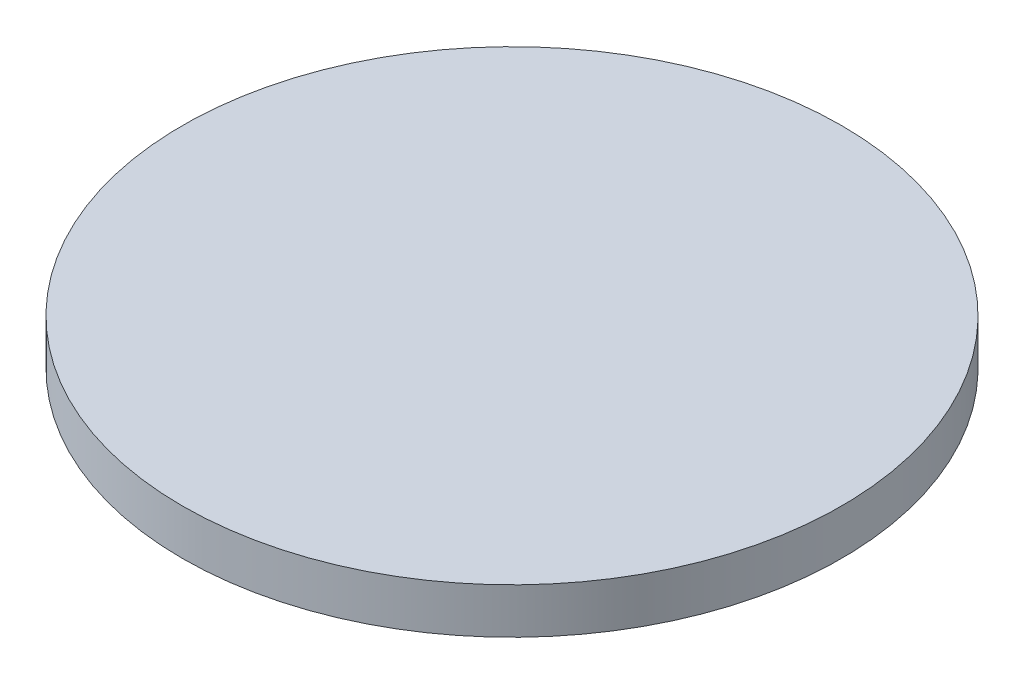
ISO-10303-21;
HEADER;
FILE_DESCRIPTION(('STEP AP214'),'2;1');
FILE_NAME('part.step','',(''),(''),'','','');
FILE_SCHEMA(('AUTOMOTIVE_DESIGN { 1 0 10303 214 1 1 1 1 }'));
ENDSEC;
DATA;
#1=APPLICATION_CONTEXT('core data for automotive mechanical design processes');
#2=APPLICATION_PROTOCOL_DEFINITION('international standard','automotive_design',2000,#1);
#3=PRODUCT_CONTEXT('',#1,'mechanical');
#4=PRODUCT('Part','Part','',(#3));
#5=PRODUCT_RELATED_PRODUCT_CATEGORY('part','',(#4));
#6=PRODUCT_DEFINITION_FORMATION('','',#4);
#7=PRODUCT_DEFINITION_CONTEXT('part definition',#1,'design');
#8=PRODUCT_DEFINITION('design','',#6,#7);
#9=PRODUCT_DEFINITION_SHAPE('','',#8);
#10=(LENGTH_UNIT() NAMED_UNIT(*) SI_UNIT(.MILLI.,.METRE.));
#11=(NAMED_UNIT(*) PLANE_ANGLE_UNIT() SI_UNIT($,.RADIAN.));
#12=(NAMED_UNIT(*) SI_UNIT($,.STERADIAN.) SOLID_ANGLE_UNIT());
#13=UNCERTAINTY_MEASURE_WITH_UNIT(LENGTH_MEASURE(1.E-05),#10,'distance_accuracy_value','');
#14=(GEOMETRIC_REPRESENTATION_CONTEXT(3) GLOBAL_UNCERTAINTY_ASSIGNED_CONTEXT((#13)) GLOBAL_UNIT_ASSIGNED_CONTEXT((#10,
#11,#12)) REPRESENTATION_CONTEXT('',''));
#15=CARTESIAN_POINT('',(0.,0.,0.));
#16=DIRECTION('',(0.,0.,1.));
#17=DIRECTION('',(1.,0.,0.));
#18=AXIS2_PLACEMENT_3D('',#15,#16,#17);
#19=CARTESIAN_POINT('',(350.,1020.,-280.));
#20=DIRECTION('',(0.,-1.,0.));
#21=DIRECTION('',(0.,0.,-1.));
#22=AXIS2_PLACEMENT_3D('',#19,#20,#21);
#23=CYLINDRICAL_SURFACE('',#22,145.);
#24=CARTESIAN_POINT('',(350.,1020.,-280.));
#25=DIRECTION('',(0.,1.,0.));
#26=DIRECTION('',(0.,0.,1.));
#27=AXIS2_PLACEMENT_3D('',#24,#25,#26);
#28=CIRCLE('',#27,145.);
#29=CARTESIAN_POINT('',(350.,1020.,-135.));
#30=VERTEX_POINT('',#29);
#31=EDGE_CURVE('E10',#30,#30,#28,.T.);
#32=ORIENTED_EDGE('',*,*,#31,.F.);
#33=EDGE_LOOP('',(#32));
#34=FACE_BOUND('',#33,.T.);
#35=CARTESIAN_POINT('',(350.,1000.,-280.));
#36=DIRECTION('',(0.,1.,0.));
#37=DIRECTION('',(0.,0.,1.));
#38=AXIS2_PLACEMENT_3D('',#35,#36,#37);
#39=CIRCLE('',#38,145.);
#40=CARTESIAN_POINT('',(350.,1000.,-135.));
#41=VERTEX_POINT('',#40);
#42=EDGE_CURVE('E40',#41,#41,#39,.T.);
#43=ORIENTED_EDGE('',*,*,#42,.T.);
#44=EDGE_LOOP('',(#43));
#45=FACE_BOUND('',#44,.T.);
#46=ADVANCED_FACE('F37',(#34,#45),#23,.T.);
#47=CARTESIAN_POINT('',(350.,1020.,-280.));
#48=DIRECTION('',(0.,1.,0.));
#49=DIRECTION('',(0.,0.,1.));
#50=AXIS2_PLACEMENT_3D('',#47,#48,#49);
#51=PLANE('',#50);
#52=ORIENTED_EDGE('',*,*,#31,.T.);
#53=EDGE_LOOP('',(#52));
#54=FACE_BOUND('',#53,.T.);
#55=ADVANCED_FACE('F52',(#54),#51,.T.);
#56=CARTESIAN_POINT('',(350.,1000.,-280.));
#57=DIRECTION('',(0.,1.,0.));
#58=DIRECTION('',(0.,0.,1.));
#59=AXIS2_PLACEMENT_3D('',#56,#57,#58);
#60=PLANE('',#59);
#61=ORIENTED_EDGE('',*,*,#42,.F.);
#62=EDGE_LOOP('',(#61));
#63=FACE_BOUND('',#62,.T.);
#64=ADVANCED_FACE('F50',(#63),#60,.F.);
#65=CLOSED_SHELL('',(#46,#55,#64));
#66=MANIFOLD_SOLID_BREP('B2',#65);
#67=ADVANCED_BREP_SHAPE_REPRESENTATION('',(#18,#66),#14);
#68=SHAPE_DEFINITION_REPRESENTATION(#9,#67);
ENDSEC;
END-ISO-10303-21;
